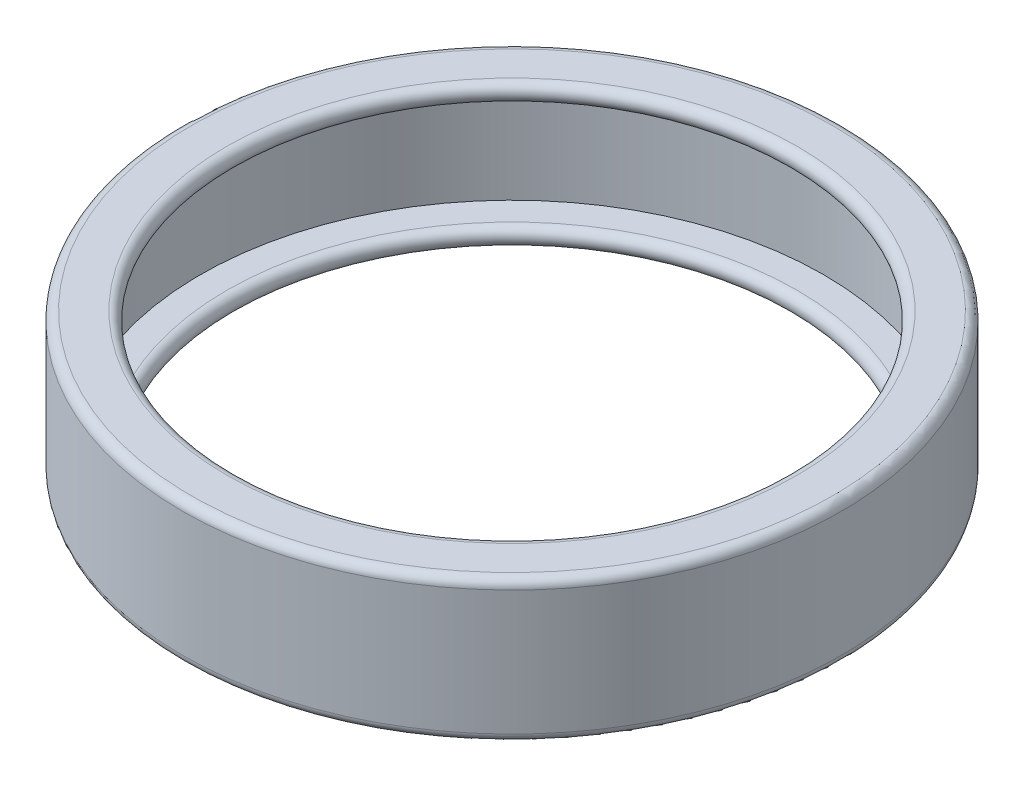
ISO-10303-21;
HEADER;
FILE_DESCRIPTION(('STEP AP214'),'2;1');
FILE_NAME('part.step','',(''),(''),'','','');
FILE_SCHEMA(('AUTOMOTIVE_DESIGN { 1 0 10303 214 1 1 1 1 }'));
ENDSEC;
DATA;
#1=APPLICATION_CONTEXT('core data for automotive mechanical design processes');
#2=APPLICATION_PROTOCOL_DEFINITION('international standard','automotive_design',2000,#1);
#3=PRODUCT_CONTEXT('',#1,'mechanical');
#4=PRODUCT('Part','Part','',(#3));
#5=PRODUCT_RELATED_PRODUCT_CATEGORY('part','',(#4));
#6=PRODUCT_DEFINITION_FORMATION('','',#4);
#7=PRODUCT_DEFINITION_CONTEXT('part definition',#1,'design');
#8=PRODUCT_DEFINITION('design','',#6,#7);
#9=PRODUCT_DEFINITION_SHAPE('','',#8);
#10=(LENGTH_UNIT() NAMED_UNIT(*) SI_UNIT(.MILLI.,.METRE.));
#11=(NAMED_UNIT(*) PLANE_ANGLE_UNIT() SI_UNIT($,.RADIAN.));
#12=(NAMED_UNIT(*) SI_UNIT($,.STERADIAN.) SOLID_ANGLE_UNIT());
#13=UNCERTAINTY_MEASURE_WITH_UNIT(LENGTH_MEASURE(1.E-05),#10,'distance_accuracy_value','');
#14=(GEOMETRIC_REPRESENTATION_CONTEXT(3) GLOBAL_UNCERTAINTY_ASSIGNED_CONTEXT((#13)) GLOBAL_UNIT_ASSIGNED_CONTEXT((#10,
#11,#12)) REPRESENTATION_CONTEXT('',''));
#15=CARTESIAN_POINT('',(0.,0.,0.));
#16=DIRECTION('',(0.,0.,1.));
#17=DIRECTION('',(1.,0.,0.));
#18=AXIS2_PLACEMENT_3D('',#15,#16,#17);
#19=CARTESIAN_POINT('',(0.,-3.5,0.));
#20=DIRECTION('',(0.,-1.,0.));
#21=DIRECTION('',(0.,0.,-1.));
#22=AXIS2_PLACEMENT_3D('',#19,#20,#21);
#23=TOROIDAL_SURFACE('',#22,16.,0.5);
#24=CARTESIAN_POINT('',(0.,-4.,0.));
#25=DIRECTION('',(0.,1.,0.));
#26=DIRECTION('',(0.,0.,1.));
#27=AXIS2_PLACEMENT_3D('',#24,#25,#26);
#28=CIRCLE('',#27,16.);
#29=CARTESIAN_POINT('',(0.,-4.,16.));
#30=VERTEX_POINT('',#29);
#31=EDGE_CURVE('E48',#30,#30,#28,.T.);
#32=ORIENTED_EDGE('',*,*,#31,.F.);
#33=EDGE_LOOP('',(#32));
#34=FACE_BOUND('',#33,.T.);
#35=CARTESIAN_POINT('',(0.,-3.,0.));
#36=DIRECTION('',(0.,-1.,0.));
#37=DIRECTION('',(0.,0.,-1.));
#38=AXIS2_PLACEMENT_3D('',#35,#36,#37);
#39=CIRCLE('',#38,16.);
#40=CARTESIAN_POINT('',(0.,-3.,-16.));
#41=VERTEX_POINT('',#40);
#42=EDGE_CURVE('E10',#41,#41,#39,.T.);
#43=ORIENTED_EDGE('',*,*,#42,.F.);
#44=EDGE_LOOP('',(#43));
#45=FACE_BOUND('',#44,.T.);
#46=ADVANCED_FACE('F41',(#34,#45),#23,.T.);
#47=CARTESIAN_POINT('',(0.,3.5,0.));
#48=DIRECTION('',(0.,-1.,0.));
#49=DIRECTION('',(0.,0.,-1.));
#50=AXIS2_PLACEMENT_3D('',#47,#48,#49);
#51=TOROIDAL_SURFACE('',#50,16.,0.5);
#52=CARTESIAN_POINT('',(0.,4.,0.));
#53=DIRECTION('',(0.,-1.,0.));
#54=DIRECTION('',(0.,0.,-1.));
#55=AXIS2_PLACEMENT_3D('',#52,#53,#54);
#56=CIRCLE('',#55,16.);
#57=CARTESIAN_POINT('',(0.,4.,-16.));
#58=VERTEX_POINT('',#57);
#59=EDGE_CURVE('E57',#58,#58,#56,.T.);
#60=ORIENTED_EDGE('',*,*,#59,.F.);
#61=EDGE_LOOP('',(#60));
#62=FACE_BOUND('',#61,.T.);
#63=CARTESIAN_POINT('',(0.,3.,0.));
#64=DIRECTION('',(0.,1.,0.));
#65=DIRECTION('',(0.,0.,1.));
#66=AXIS2_PLACEMENT_3D('',#63,#64,#65);
#67=CIRCLE('',#66,16.);
#68=CARTESIAN_POINT('',(0.,3.,16.));
#69=VERTEX_POINT('',#68);
#70=EDGE_CURVE('E55',#69,#69,#67,.T.);
#71=ORIENTED_EDGE('',*,*,#70,.F.);
#72=EDGE_LOOP('',(#71));
#73=FACE_BOUND('',#72,.T.);
#74=ADVANCED_FACE('F98',(#62,#73),#51,.T.);
#75=CARTESIAN_POINT('',(0.,-4.,15.5));
#76=DIRECTION('',(0.,1.,0.));
#77=DIRECTION('',(0.,0.,1.));
#78=AXIS2_PLACEMENT_3D('',#75,#76,#77);
#79=PLANE('',#78);
#80=ORIENTED_EDGE('',*,*,#31,.T.);
#81=EDGE_LOOP('',(#80));
#82=FACE_BOUND('',#81,.T.);
#83=CARTESIAN_POINT('',(0.,-4.,0.));
#84=DIRECTION('',(0.,1.,0.));
#85=DIRECTION('',(0.,0.,1.));
#86=AXIS2_PLACEMENT_3D('',#83,#84,#85);
#87=CIRCLE('',#86,18.);
#88=CARTESIAN_POINT('',(0.,-4.,18.));
#89=VERTEX_POINT('',#88);
#90=EDGE_CURVE('E69',#89,#89,#87,.F.);
#91=ORIENTED_EDGE('',*,*,#90,.T.);
#92=EDGE_LOOP('',(#91));
#93=FACE_BOUND('',#92,.T.);
#94=ADVANCED_FACE('F102',(#82,#93),#79,.F.);
#95=CARTESIAN_POINT('',(0.,-15.4469304837593,0.));
#96=DIRECTION('',(0.,-1.,0.));
#97=DIRECTION('',(0.,0.,-1.));
#98=AXIS2_PLACEMENT_3D('',#95,#96,#97);
#99=CYLINDRICAL_SURFACE('',#98,18.5);
#100=CARTESIAN_POINT('',(0.,-3.5,0.));
#101=DIRECTION('',(0.,1.,0.));
#102=DIRECTION('',(0.,0.,1.));
#103=AXIS2_PLACEMENT_3D('',#100,#101,#102);
#104=CIRCLE('',#103,18.5);
#105=CARTESIAN_POINT('',(0.,-3.5,18.5));
#106=VERTEX_POINT('',#105);
#107=EDGE_CURVE('E62',#106,#106,#104,.T.);
#108=ORIENTED_EDGE('',*,*,#107,.T.);
#109=EDGE_LOOP('',(#108));
#110=FACE_BOUND('',#109,.T.);
#111=CARTESIAN_POINT('',(0.,3.5,0.));
#112=DIRECTION('',(0.,-1.,0.));
#113=DIRECTION('',(0.,0.,-1.));
#114=AXIS2_PLACEMENT_3D('',#111,#112,#113);
#115=CIRCLE('',#114,18.5);
#116=CARTESIAN_POINT('',(0.,3.5,-18.5));
#117=VERTEX_POINT('',#116);
#118=EDGE_CURVE('E70',#117,#117,#115,.T.);
#119=ORIENTED_EDGE('',*,*,#118,.T.);
#120=EDGE_LOOP('',(#119));
#121=FACE_BOUND('',#120,.T.);
#122=ADVANCED_FACE('F112',(#110,#121),#99,.T.);
#123=CARTESIAN_POINT('',(0.,4.,18.5));
#124=DIRECTION('',(0.,-1.,0.));
#125=DIRECTION('',(0.,0.,-1.));
#126=AXIS2_PLACEMENT_3D('',#123,#124,#125);
#127=PLANE('',#126);
#128=ORIENTED_EDGE('',*,*,#59,.T.);
#129=EDGE_LOOP('',(#128));
#130=FACE_BOUND('',#129,.T.);
#131=CARTESIAN_POINT('',(0.,4.,0.));
#132=DIRECTION('',(0.,-1.,0.));
#133=DIRECTION('',(0.,0.,-1.));
#134=AXIS2_PLACEMENT_3D('',#131,#132,#133);
#135=CIRCLE('',#134,18.);
#136=CARTESIAN_POINT('',(0.,4.,-18.));
#137=VERTEX_POINT('',#136);
#138=EDGE_CURVE('E63',#137,#137,#135,.F.);
#139=ORIENTED_EDGE('',*,*,#138,.T.);
#140=EDGE_LOOP('',(#139));
#141=FACE_BOUND('',#140,.T.);
#142=ADVANCED_FACE('F123',(#130,#141),#127,.F.);
#143=CARTESIAN_POINT('',(0.,3.,15.5));
#144=DIRECTION('',(0.,1.,0.));
#145=DIRECTION('',(0.,0.,1.));
#146=AXIS2_PLACEMENT_3D('',#143,#144,#145);
#147=PLANE('',#146);
#148=ORIENTED_EDGE('',*,*,#70,.T.);
#149=EDGE_LOOP('',(#148));
#150=FACE_BOUND('',#149,.T.);
#151=CARTESIAN_POINT('',(0.,3.,0.));
#152=DIRECTION('',(0.,-1.,0.));
#153=DIRECTION('',(0.,0.,-1.));
#154=AXIS2_PLACEMENT_3D('',#151,#152,#153);
#155=CIRCLE('',#154,17.5);
#156=CARTESIAN_POINT('',(0.,3.,-17.5));
#157=VERTEX_POINT('',#156);
#158=EDGE_CURVE('E71',#157,#157,#155,.T.);
#159=ORIENTED_EDGE('',*,*,#158,.T.);
#160=EDGE_LOOP('',(#159));
#161=FACE_BOUND('',#160,.T.);
#162=ADVANCED_FACE('F94',(#150,#161),#147,.F.);
#163=CARTESIAN_POINT('',(0.,-15.4469304837593,0.));
#164=DIRECTION('',(0.,-1.,0.));
#165=DIRECTION('',(0.,0.,-1.));
#166=AXIS2_PLACEMENT_3D('',#163,#164,#165);
#167=CYLINDRICAL_SURFACE('',#166,17.5);
#168=ORIENTED_EDGE('',*,*,#158,.F.);
#169=EDGE_LOOP('',(#168));
#170=FACE_BOUND('',#169,.T.);
#171=CARTESIAN_POINT('',(0.,-3.,0.));
#172=DIRECTION('',(0.,-1.,0.));
#173=DIRECTION('',(0.,0.,-1.));
#174=AXIS2_PLACEMENT_3D('',#171,#172,#173);
#175=CIRCLE('',#174,17.5);
#176=CARTESIAN_POINT('',(0.,-3.,-17.5));
#177=VERTEX_POINT('',#176);
#178=EDGE_CURVE('E78',#177,#177,#175,.T.);
#179=ORIENTED_EDGE('',*,*,#178,.T.);
#180=EDGE_LOOP('',(#179));
#181=FACE_BOUND('',#180,.T.);
#182=ADVANCED_FACE('F79',(#170,#181),#167,.F.);
#183=CARTESIAN_POINT('',(0.,-3.,17.5));
#184=DIRECTION('',(0.,-1.,0.));
#185=DIRECTION('',(0.,0.,-1.));
#186=AXIS2_PLACEMENT_3D('',#183,#184,#185);
#187=PLANE('',#186);
#188=ORIENTED_EDGE('',*,*,#42,.T.);
#189=EDGE_LOOP('',(#188));
#190=FACE_BOUND('',#189,.T.);
#191=ORIENTED_EDGE('',*,*,#178,.F.);
#192=EDGE_LOOP('',(#191));
#193=FACE_BOUND('',#192,.T.);
#194=ADVANCED_FACE('F85',(#190,#193),#187,.F.);
#195=CARTESIAN_POINT('',(0.,-3.5,0.));
#196=DIRECTION('',(0.,1.,0.));
#197=DIRECTION('',(0.,0.,1.));
#198=AXIS2_PLACEMENT_3D('',#195,#196,#197);
#199=TOROIDAL_SURFACE('',#198,18.,0.5);
#200=ORIENTED_EDGE('',*,*,#107,.F.);
#201=EDGE_LOOP('',(#200));
#202=FACE_BOUND('',#201,.T.);
#203=ORIENTED_EDGE('',*,*,#90,.F.);
#204=EDGE_LOOP('',(#203));
#205=FACE_BOUND('',#204,.T.);
#206=ADVANCED_FACE('F82',(#202,#205),#199,.T.);
#207=CARTESIAN_POINT('',(0.,3.5,0.));
#208=DIRECTION('',(0.,-1.,0.));
#209=DIRECTION('',(0.,0.,-1.));
#210=AXIS2_PLACEMENT_3D('',#207,#208,#209);
#211=TOROIDAL_SURFACE('',#210,18.,0.5);
#212=ORIENTED_EDGE('',*,*,#138,.F.);
#213=EDGE_LOOP('',(#212));
#214=FACE_BOUND('',#213,.T.);
#215=ORIENTED_EDGE('',*,*,#118,.F.);
#216=EDGE_LOOP('',(#215));
#217=FACE_BOUND('',#216,.T.);
#218=ADVANCED_FACE('F89',(#214,#217),#211,.T.);
#219=CLOSED_SHELL('',(#46,#74,#94,#122,#142,#162,#182,#194,#206,#218));
#220=MANIFOLD_SOLID_BREP('B2',#219);
#221=ADVANCED_BREP_SHAPE_REPRESENTATION('',(#18,#220),#14);
#222=SHAPE_DEFINITION_REPRESENTATION(#9,#221);
ENDSEC;
END-ISO-10303-21;
